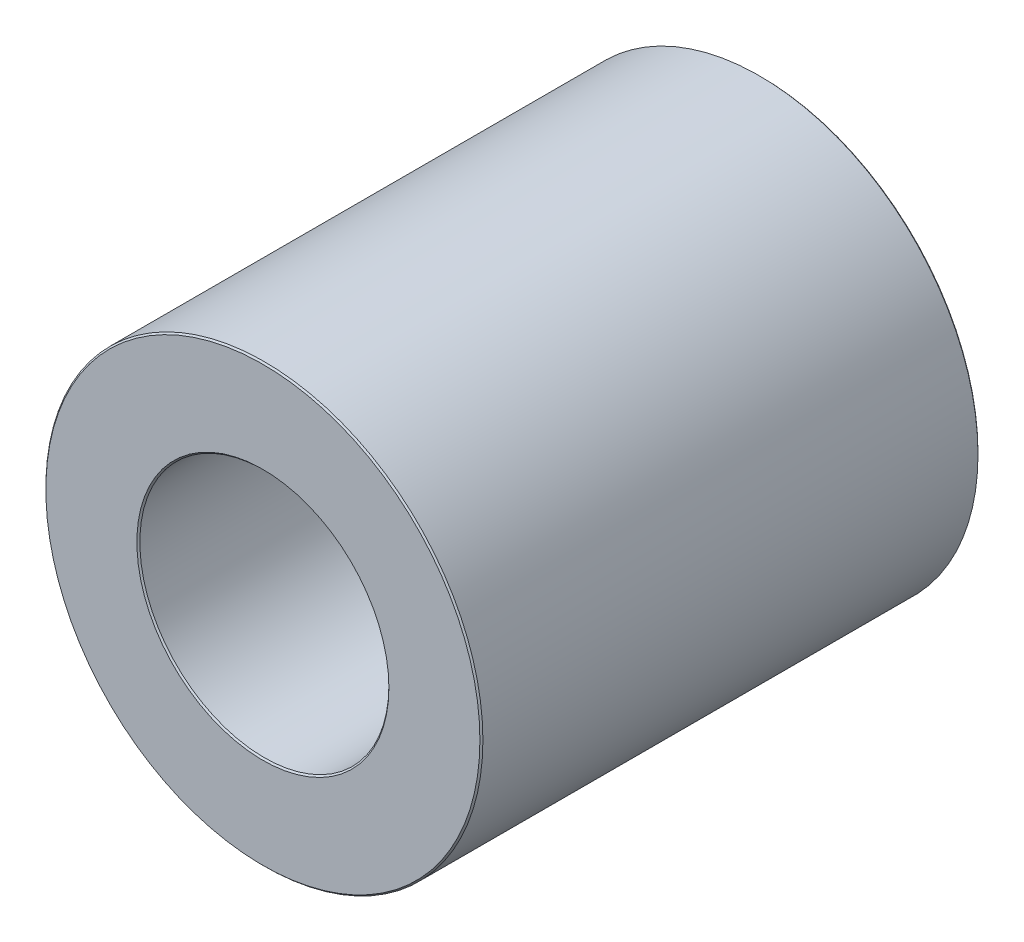
ISO-10303-21;
HEADER;
FILE_DESCRIPTION(('STEP AP214'),'2;1');
FILE_NAME('part.step','',(''),(''),'','','');
FILE_SCHEMA(('AUTOMOTIVE_DESIGN { 1 0 10303 214 1 1 1 1 }'));
ENDSEC;
DATA;
#1=APPLICATION_CONTEXT('core data for automotive mechanical design processes');
#2=APPLICATION_PROTOCOL_DEFINITION('international standard','automotive_design',2000,#1);
#3=PRODUCT_CONTEXT('',#1,'mechanical');
#4=PRODUCT('Part','Part','',(#3));
#5=PRODUCT_RELATED_PRODUCT_CATEGORY('part','',(#4));
#6=PRODUCT_DEFINITION_FORMATION('','',#4);
#7=PRODUCT_DEFINITION_CONTEXT('part definition',#1,'design');
#8=PRODUCT_DEFINITION('design','',#6,#7);
#9=PRODUCT_DEFINITION_SHAPE('','',#8);
#10=(LENGTH_UNIT() NAMED_UNIT(*) SI_UNIT(.MILLI.,.METRE.));
#11=(NAMED_UNIT(*) PLANE_ANGLE_UNIT() SI_UNIT($,.RADIAN.));
#12=(NAMED_UNIT(*) SI_UNIT($,.STERADIAN.) SOLID_ANGLE_UNIT());
#13=UNCERTAINTY_MEASURE_WITH_UNIT(LENGTH_MEASURE(1.E-05),#10,'distance_accuracy_value','');
#14=(GEOMETRIC_REPRESENTATION_CONTEXT(3) GLOBAL_UNCERTAINTY_ASSIGNED_CONTEXT((#13)) GLOBAL_UNIT_ASSIGNED_CONTEXT((#10,
#11,#12)) REPRESENTATION_CONTEXT('',''));
#15=CARTESIAN_POINT('',(0.,0.,0.));
#16=DIRECTION('',(0.,0.,1.));
#17=DIRECTION('',(1.,0.,0.));
#18=AXIS2_PLACEMENT_3D('',#15,#16,#17);
#19=CARTESIAN_POINT('',(0.,0.,4.));
#20=DIRECTION('',(0.,0.,1.));
#21=DIRECTION('',(1.,0.,0.));
#22=AXIS2_PLACEMENT_3D('',#19,#20,#21);
#23=PLANE('',#22);
#24=CARTESIAN_POINT('',(0.,0.,4.));
#25=DIRECTION('',(0.,0.,1.));
#26=DIRECTION('',(1.,0.,0.));
#27=AXIS2_PLACEMENT_3D('',#24,#25,#26);
#28=CIRCLE('',#27,2.024);
#29=CARTESIAN_POINT('',(2.024,0.,4.));
#30=VERTEX_POINT('',#29);
#31=EDGE_CURVE('E10',#30,#30,#28,.F.);
#32=ORIENTED_EDGE('',*,*,#31,.T.);
#33=EDGE_LOOP('',(#32));
#34=FACE_BOUND('',#33,.T.);
#35=CARTESIAN_POINT('',(0.,0.,4.));
#36=DIRECTION('',(0.,0.,1.));
#37=DIRECTION('',(1.,0.,0.));
#38=AXIS2_PLACEMENT_3D('',#35,#36,#37);
#39=CIRCLE('',#38,3.486);
#40=CARTESIAN_POINT('',(3.486,0.,4.));
#41=VERTEX_POINT('',#40);
#42=EDGE_CURVE('E49',#41,#41,#39,.T.);
#43=ORIENTED_EDGE('',*,*,#42,.T.);
#44=EDGE_LOOP('',(#43));
#45=FACE_BOUND('',#44,.T.);
#46=ADVANCED_FACE('F41',(#34,#45),#23,.T.);
#47=CARTESIAN_POINT('',(0.,0.,4.));
#48=DIRECTION('',(0.,0.,-1.));
#49=DIRECTION('',(-1.,0.,0.));
#50=AXIS2_PLACEMENT_3D('',#47,#48,#49);
#51=CYLINDRICAL_SURFACE('',#50,3.51);
#52=CARTESIAN_POINT('',(0.,0.,-3.976));
#53=DIRECTION('',(0.,0.,1.));
#54=DIRECTION('',(1.,0.,0.));
#55=AXIS2_PLACEMENT_3D('',#52,#53,#54);
#56=CIRCLE('',#55,3.51);
#57=CARTESIAN_POINT('',(3.51,0.,-3.976));
#58=VERTEX_POINT('',#57);
#59=EDGE_CURVE('E73',#58,#58,#56,.T.);
#60=ORIENTED_EDGE('',*,*,#59,.T.);
#61=EDGE_LOOP('',(#60));
#62=FACE_BOUND('',#61,.T.);
#63=CARTESIAN_POINT('',(0.,0.,3.976));
#64=DIRECTION('',(0.,0.,1.));
#65=DIRECTION('',(1.,0.,0.));
#66=AXIS2_PLACEMENT_3D('',#63,#64,#65);
#67=CIRCLE('',#66,3.51);
#68=CARTESIAN_POINT('',(3.51,0.,3.976));
#69=VERTEX_POINT('',#68);
#70=EDGE_CURVE('E77',#69,#69,#67,.F.);
#71=ORIENTED_EDGE('',*,*,#70,.T.);
#72=EDGE_LOOP('',(#71));
#73=FACE_BOUND('',#72,.T.);
#74=ADVANCED_FACE('F82',(#62,#73),#51,.T.);
#75=CARTESIAN_POINT('',(0.,0.,4.));
#76=DIRECTION('',(0.,0.,-1.));
#77=DIRECTION('',(-1.,0.,0.));
#78=AXIS2_PLACEMENT_3D('',#75,#76,#77);
#79=CYLINDRICAL_SURFACE('',#78,2.);
#80=CARTESIAN_POINT('',(0.,0.,-3.976));
#81=DIRECTION('',(0.,0.,1.));
#82=DIRECTION('',(1.,0.,0.));
#83=AXIS2_PLACEMENT_3D('',#80,#81,#82);
#84=CIRCLE('',#83,2.);
#85=CARTESIAN_POINT('',(2.,0.,-3.976));
#86=VERTEX_POINT('',#85);
#87=EDGE_CURVE('E54',#86,#86,#84,.F.);
#88=ORIENTED_EDGE('',*,*,#87,.T.);
#89=EDGE_LOOP('',(#88));
#90=FACE_BOUND('',#89,.T.);
#91=CARTESIAN_POINT('',(0.,0.,3.976));
#92=DIRECTION('',(0.,0.,1.));
#93=DIRECTION('',(1.,0.,0.));
#94=AXIS2_PLACEMENT_3D('',#91,#92,#93);
#95=CIRCLE('',#94,2.);
#96=CARTESIAN_POINT('',(2.,0.,3.976));
#97=VERTEX_POINT('',#96);
#98=EDGE_CURVE('E59',#97,#97,#95,.T.);
#99=ORIENTED_EDGE('',*,*,#98,.T.);
#100=EDGE_LOOP('',(#99));
#101=FACE_BOUND('',#100,.T.);
#102=ADVANCED_FACE('F97',(#90,#101),#79,.F.);
#103=CARTESIAN_POINT('',(0.,0.,-4.));
#104=DIRECTION('',(0.,0.,1.));
#105=DIRECTION('',(1.,0.,0.));
#106=AXIS2_PLACEMENT_3D('',#103,#104,#105);
#107=PLANE('',#106);
#108=CARTESIAN_POINT('',(0.,0.,-4.));
#109=DIRECTION('',(0.,0.,1.));
#110=DIRECTION('',(1.,0.,0.));
#111=AXIS2_PLACEMENT_3D('',#108,#109,#110);
#112=CIRCLE('',#111,3.486);
#113=CARTESIAN_POINT('',(3.486,0.,-4.));
#114=VERTEX_POINT('',#113);
#115=EDGE_CURVE('E65',#114,#114,#112,.F.);
#116=ORIENTED_EDGE('',*,*,#115,.T.);
#117=EDGE_LOOP('',(#116));
#118=FACE_BOUND('',#117,.T.);
#119=CARTESIAN_POINT('',(0.,0.,-4.));
#120=DIRECTION('',(0.,0.,1.));
#121=DIRECTION('',(1.,0.,0.));
#122=AXIS2_PLACEMENT_3D('',#119,#120,#121);
#123=CIRCLE('',#122,2.024);
#124=CARTESIAN_POINT('',(2.024,0.,-4.));
#125=VERTEX_POINT('',#124);
#126=EDGE_CURVE('E69',#125,#125,#123,.T.);
#127=ORIENTED_EDGE('',*,*,#126,.T.);
#128=EDGE_LOOP('',(#127));
#129=FACE_BOUND('',#128,.T.);
#130=ADVANCED_FACE('F106',(#118,#129),#107,.F.);
#131=CARTESIAN_POINT('',(0.,0.,-3.976));
#132=DIRECTION('',(0.,0.,1.));
#133=DIRECTION('',(1.,0.,0.));
#134=AXIS2_PLACEMENT_3D('',#131,#132,#133);
#135=CONICAL_SURFACE('',#134,3.51,0.785398163397439);
#136=ORIENTED_EDGE('',*,*,#115,.F.);
#137=EDGE_LOOP('',(#136));
#138=FACE_BOUND('',#137,.T.);
#139=ORIENTED_EDGE('',*,*,#59,.F.);
#140=EDGE_LOOP('',(#139));
#141=FACE_BOUND('',#140,.T.);
#142=ADVANCED_FACE('F103',(#138,#141),#135,.T.);
#143=CARTESIAN_POINT('',(0.,0.,-4.));
#144=DIRECTION('',(0.,0.,-1.));
#145=DIRECTION('',(-1.,0.,0.));
#146=AXIS2_PLACEMENT_3D('',#143,#144,#145);
#147=CONICAL_SURFACE('',#146,2.024,0.78539816339743);
#148=ORIENTED_EDGE('',*,*,#87,.F.);
#149=EDGE_LOOP('',(#148));
#150=FACE_BOUND('',#149,.T.);
#151=ORIENTED_EDGE('',*,*,#126,.F.);
#152=EDGE_LOOP('',(#151));
#153=FACE_BOUND('',#152,.T.);
#154=ADVANCED_FACE('F90',(#150,#153),#147,.F.);
#155=CARTESIAN_POINT('',(0.,0.,3.976));
#156=DIRECTION('',(0.,0.,1.));
#157=DIRECTION('',(1.,0.,0.));
#158=AXIS2_PLACEMENT_3D('',#155,#156,#157);
#159=CONICAL_SURFACE('',#158,2.,0.785398163397448);
#160=ORIENTED_EDGE('',*,*,#31,.F.);
#161=EDGE_LOOP('',(#160));
#162=FACE_BOUND('',#161,.T.);
#163=ORIENTED_EDGE('',*,*,#98,.F.);
#164=EDGE_LOOP('',(#163));
#165=FACE_BOUND('',#164,.T.);
#166=ADVANCED_FACE('F86',(#162,#165),#159,.F.);
#167=CARTESIAN_POINT('',(0.,0.,4.));
#168=DIRECTION('',(0.,0.,-1.));
#169=DIRECTION('',(-1.,0.,0.));
#170=AXIS2_PLACEMENT_3D('',#167,#168,#169);
#171=CONICAL_SURFACE('',#170,3.486,0.785398163397448);
#172=ORIENTED_EDGE('',*,*,#70,.F.);
#173=EDGE_LOOP('',(#172));
#174=FACE_BOUND('',#173,.T.);
#175=ORIENTED_EDGE('',*,*,#42,.F.);
#176=EDGE_LOOP('',(#175));
#177=FACE_BOUND('',#176,.T.);
#178=ADVANCED_FACE('F43',(#174,#177),#171,.T.);
#179=CLOSED_SHELL('',(#46,#74,#102,#130,#142,#154,#166,#178));
#180=MANIFOLD_SOLID_BREP('B2',#179);
#181=ADVANCED_BREP_SHAPE_REPRESENTATION('',(#18,#180),#14);
#182=SHAPE_DEFINITION_REPRESENTATION(#9,#181);
ENDSEC;
END-ISO-10303-21;
